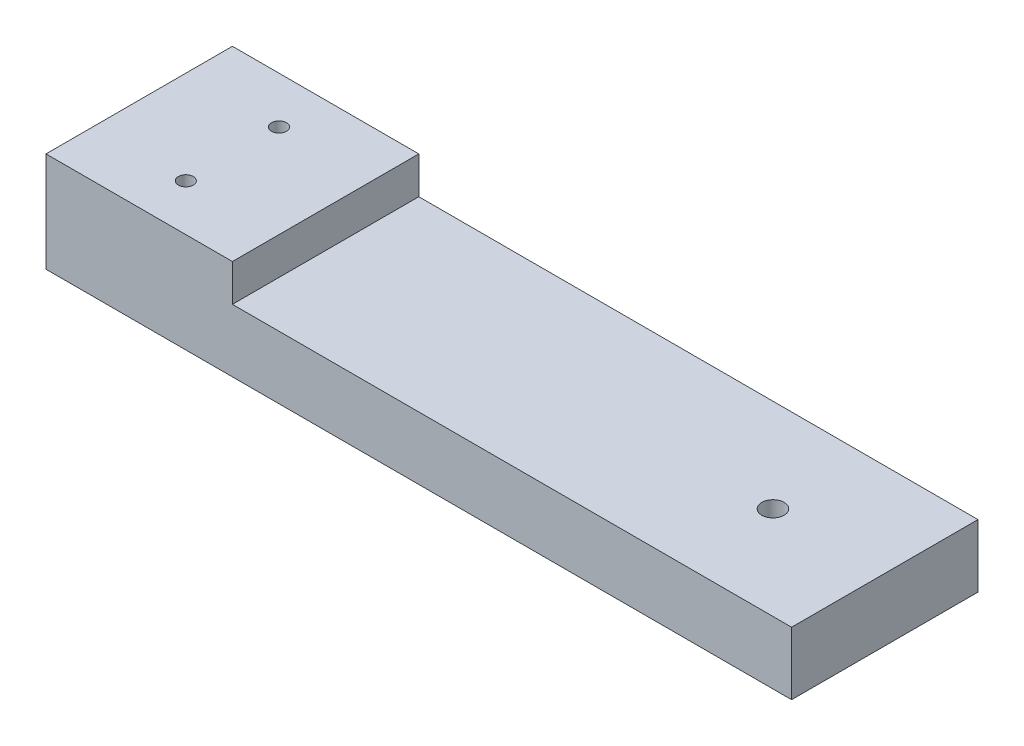
ISO-10303-21;
HEADER;
FILE_DESCRIPTION(('STEP AP214'),'2;1');
FILE_NAME('part.step','',(''),(''),'','','');
FILE_SCHEMA(('AUTOMOTIVE_DESIGN { 1 0 10303 214 1 1 1 1 }'));
ENDSEC;
DATA;
#1=APPLICATION_CONTEXT('core data for automotive mechanical design processes');
#2=APPLICATION_PROTOCOL_DEFINITION('international standard','automotive_design',2000,#1);
#3=PRODUCT_CONTEXT('',#1,'mechanical');
#4=PRODUCT('Part','Part','',(#3));
#5=PRODUCT_RELATED_PRODUCT_CATEGORY('part','',(#4));
#6=PRODUCT_DEFINITION_FORMATION('','',#4);
#7=PRODUCT_DEFINITION_CONTEXT('part definition',#1,'design');
#8=PRODUCT_DEFINITION('design','',#6,#7);
#9=PRODUCT_DEFINITION_SHAPE('','',#8);
#10=(LENGTH_UNIT() NAMED_UNIT(*) SI_UNIT(.MILLI.,.METRE.));
#11=(NAMED_UNIT(*) PLANE_ANGLE_UNIT() SI_UNIT($,.RADIAN.));
#12=(NAMED_UNIT(*) SI_UNIT($,.STERADIAN.) SOLID_ANGLE_UNIT());
#13=UNCERTAINTY_MEASURE_WITH_UNIT(LENGTH_MEASURE(1.E-05),#10,'distance_accuracy_value','');
#14=(GEOMETRIC_REPRESENTATION_CONTEXT(3) GLOBAL_UNCERTAINTY_ASSIGNED_CONTEXT((#13)) GLOBAL_UNIT_ASSIGNED_CONTEXT((#10,
#11,#12)) REPRESENTATION_CONTEXT('',''));
#15=CARTESIAN_POINT('',(0.,0.,0.));
#16=DIRECTION('',(0.,0.,1.));
#17=DIRECTION('',(1.,0.,0.));
#18=AXIS2_PLACEMENT_3D('',#15,#16,#17);
#19=CARTESIAN_POINT('',(0.,26.8,0.));
#20=DIRECTION('',(0.,0.,-1.));
#21=DIRECTION('',(-1.,0.,0.));
#22=AXIS2_PLACEMENT_3D('',#19,#20,#21);
#23=PLANE('',#22);
#24=DIRECTION('',(1.,0.,0.));
#25=VECTOR('',#24,1.);
#26=CARTESIAN_POINT('',(0.,0.,0.));
#27=LINE('',#26,#25);
#28=CARTESIAN_POINT('',(0.,0.,0.));
#29=VERTEX_POINT('',#28);
#30=CARTESIAN_POINT('',(200.,0.,0.));
#31=VERTEX_POINT('',#30);
#32=EDGE_CURVE('E108',#29,#31,#27,.T.);
#33=ORIENTED_EDGE('',*,*,#32,.T.);
#34=DIRECTION('',(0.,-1.,0.));
#35=VECTOR('',#34,1.);
#36=CARTESIAN_POINT('',(200.,16.85,0.));
#37=LINE('',#36,#35);
#38=CARTESIAN_POINT('',(200.,16.85,0.));
#39=VERTEX_POINT('',#38);
#40=EDGE_CURVE('E109',#39,#31,#37,.T.);
#41=ORIENTED_EDGE('',*,*,#40,.F.);
#42=DIRECTION('',(1.,0.,0.));
#43=VECTOR('',#42,1.);
#44=CARTESIAN_POINT('',(0.,16.85,0.));
#45=LINE('',#44,#43);
#46=CARTESIAN_POINT('',(50.,16.85,0.));
#47=VERTEX_POINT('',#46);
#48=EDGE_CURVE('E112',#47,#39,#45,.T.);
#49=ORIENTED_EDGE('',*,*,#48,.F.);
#50=DIRECTION('',(0.,-1.,0.));
#51=VECTOR('',#50,1.);
#52=CARTESIAN_POINT('',(50.,26.8,0.));
#53=LINE('',#52,#51);
#54=CARTESIAN_POINT('',(50.,26.8,0.));
#55=VERTEX_POINT('',#54);
#56=EDGE_CURVE('E11',#55,#47,#53,.T.);
#57=ORIENTED_EDGE('',*,*,#56,.F.);
#58=DIRECTION('',(1.,0.,0.));
#59=VECTOR('',#58,1.);
#60=CARTESIAN_POINT('',(0.,26.8,0.));
#61=LINE('',#60,#59);
#62=CARTESIAN_POINT('',(0.,26.8,0.));
#63=VERTEX_POINT('',#62);
#64=EDGE_CURVE('E126',#63,#55,#61,.T.);
#65=ORIENTED_EDGE('',*,*,#64,.F.);
#66=DIRECTION('',(0.,-1.,0.));
#67=VECTOR('',#66,1.);
#68=CARTESIAN_POINT('',(0.,26.8,0.));
#69=LINE('',#68,#67);
#70=EDGE_CURVE('E61',#63,#29,#69,.T.);
#71=ORIENTED_EDGE('',*,*,#70,.T.);
#72=EDGE_LOOP('',(#33,#41,#49,#57,#65,#71));
#73=FACE_BOUND('',#72,.T.);
#74=ADVANCED_FACE('F37',(#73),#23,.F.);
#75=CARTESIAN_POINT('',(50.,26.8,0.));
#76=DIRECTION('',(-1.,0.,0.));
#77=DIRECTION('',(0.,0.,1.));
#78=AXIS2_PLACEMENT_3D('',#75,#76,#77);
#79=PLANE('',#78);
#80=ORIENTED_EDGE('',*,*,#56,.T.);
#81=DIRECTION('',(0.,0.,-1.));
#82=VECTOR('',#81,1.);
#83=CARTESIAN_POINT('',(50.,16.85,0.));
#84=LINE('',#83,#82);
#85=CARTESIAN_POINT('',(50.,16.85,-50.));
#86=VERTEX_POINT('',#85);
#87=EDGE_CURVE('E118',#47,#86,#84,.T.);
#88=ORIENTED_EDGE('',*,*,#87,.T.);
#89=DIRECTION('',(0.,-1.,0.));
#90=VECTOR('',#89,1.);
#91=CARTESIAN_POINT('',(50.,26.8,-50.));
#92=LINE('',#91,#90);
#93=CARTESIAN_POINT('',(50.,26.8,-50.));
#94=VERTEX_POINT('',#93);
#95=EDGE_CURVE('E45',#94,#86,#92,.T.);
#96=ORIENTED_EDGE('',*,*,#95,.F.);
#97=DIRECTION('',(0.,0.,-1.));
#98=VECTOR('',#97,1.);
#99=CARTESIAN_POINT('',(50.,26.8,0.));
#100=LINE('',#99,#98);
#101=EDGE_CURVE('E81',#55,#94,#100,.T.);
#102=ORIENTED_EDGE('',*,*,#101,.F.);
#103=EDGE_LOOP('',(#80,#88,#96,#102));
#104=FACE_BOUND('',#103,.T.);
#105=ADVANCED_FACE('F148',(#104),#79,.F.);
#106=CARTESIAN_POINT('',(0.,26.8,-50.));
#107=DIRECTION('',(0.,0.,-1.));
#108=DIRECTION('',(-1.,0.,0.));
#109=AXIS2_PLACEMENT_3D('',#106,#107,#108);
#110=PLANE('',#109);
#111=DIRECTION('',(1.,0.,0.));
#112=VECTOR('',#111,1.);
#113=CARTESIAN_POINT('',(0.,0.,-50.));
#114=LINE('',#113,#112);
#115=CARTESIAN_POINT('',(0.,0.,-50.));
#116=VERTEX_POINT('',#115);
#117=CARTESIAN_POINT('',(200.,0.,-50.));
#118=VERTEX_POINT('',#117);
#119=EDGE_CURVE('E135',#116,#118,#114,.T.);
#120=ORIENTED_EDGE('',*,*,#119,.F.);
#121=DIRECTION('',(0.,-1.,0.));
#122=VECTOR('',#121,1.);
#123=CARTESIAN_POINT('',(0.,26.8,-50.));
#124=LINE('',#123,#122);
#125=CARTESIAN_POINT('',(0.,26.8,-50.));
#126=VERTEX_POINT('',#125);
#127=EDGE_CURVE('E140',#126,#116,#124,.T.);
#128=ORIENTED_EDGE('',*,*,#127,.F.);
#129=DIRECTION('',(1.,0.,0.));
#130=VECTOR('',#129,1.);
#131=CARTESIAN_POINT('',(0.,26.8,-50.));
#132=LINE('',#131,#130);
#133=EDGE_CURVE('E130',#126,#94,#132,.T.);
#134=ORIENTED_EDGE('',*,*,#133,.T.);
#135=ORIENTED_EDGE('',*,*,#95,.T.);
#136=DIRECTION('',(1.,0.,0.));
#137=VECTOR('',#136,1.);
#138=CARTESIAN_POINT('',(0.,16.85,-50.));
#139=LINE('',#138,#137);
#140=CARTESIAN_POINT('',(200.,16.85,-50.));
#141=VERTEX_POINT('',#140);
#142=EDGE_CURVE('E52',#86,#141,#139,.T.);
#143=ORIENTED_EDGE('',*,*,#142,.T.);
#144=DIRECTION('',(0.,-1.,0.));
#145=VECTOR('',#144,1.);
#146=CARTESIAN_POINT('',(200.,16.85,-50.));
#147=LINE('',#146,#145);
#148=EDGE_CURVE('E100',#141,#118,#147,.T.);
#149=ORIENTED_EDGE('',*,*,#148,.T.);
#150=EDGE_LOOP('',(#120,#128,#134,#135,#143,#149));
#151=FACE_BOUND('',#150,.T.);
#152=ADVANCED_FACE('F116',(#151),#110,.T.);
#153=CARTESIAN_POINT('',(0.,26.8,0.));
#154=DIRECTION('',(-1.,0.,0.));
#155=DIRECTION('',(0.,0.,1.));
#156=AXIS2_PLACEMENT_3D('',#153,#154,#155);
#157=PLANE('',#156);
#158=DIRECTION('',(0.,0.,-1.));
#159=VECTOR('',#158,1.);
#160=CARTESIAN_POINT('',(0.,0.,0.));
#161=LINE('',#160,#159);
#162=EDGE_CURVE('E128',#29,#116,#161,.T.);
#163=ORIENTED_EDGE('',*,*,#162,.F.);
#164=ORIENTED_EDGE('',*,*,#70,.F.);
#165=DIRECTION('',(0.,0.,-1.));
#166=VECTOR('',#165,1.);
#167=CARTESIAN_POINT('',(0.,26.8,0.));
#168=LINE('',#167,#166);
#169=EDGE_CURVE('E132',#63,#126,#168,.T.);
#170=ORIENTED_EDGE('',*,*,#169,.T.);
#171=ORIENTED_EDGE('',*,*,#127,.T.);
#172=EDGE_LOOP('',(#163,#164,#170,#171));
#173=FACE_BOUND('',#172,.T.);
#174=ADVANCED_FACE('F142',(#173),#157,.T.);
#175=CARTESIAN_POINT('',(0.,26.8,0.));
#176=DIRECTION('',(0.,1.,0.));
#177=DIRECTION('',(0.,0.,1.));
#178=AXIS2_PLACEMENT_3D('',#175,#176,#177);
#179=PLANE('',#178);
#180=CARTESIAN_POINT('',(25.,26.8,-12.5));
#181=DIRECTION('',(0.,-1.,0.));
#182=DIRECTION('',(0.,0.,-1.));
#183=AXIS2_PLACEMENT_3D('',#180,#181,#182);
#184=CIRCLE('',#183,2.);
#185=CARTESIAN_POINT('',(25.,26.8,-14.5));
#186=VERTEX_POINT('',#185);
#187=EDGE_CURVE('E186',#186,#186,#184,.T.);
#188=ORIENTED_EDGE('',*,*,#187,.T.);
#189=EDGE_LOOP('',(#188));
#190=FACE_BOUND('',#189,.T.);
#191=CARTESIAN_POINT('',(25.,26.8,-37.5));
#192=DIRECTION('',(0.,-1.,0.));
#193=DIRECTION('',(0.,0.,-1.));
#194=AXIS2_PLACEMENT_3D('',#191,#192,#193);
#195=CIRCLE('',#194,2.);
#196=CARTESIAN_POINT('',(25.,26.8,-39.5));
#197=VERTEX_POINT('',#196);
#198=EDGE_CURVE('E194',#197,#197,#195,.T.);
#199=ORIENTED_EDGE('',*,*,#198,.T.);
#200=EDGE_LOOP('',(#199));
#201=FACE_BOUND('',#200,.T.);
#202=ORIENTED_EDGE('',*,*,#64,.T.);
#203=ORIENTED_EDGE('',*,*,#101,.T.);
#204=ORIENTED_EDGE('',*,*,#133,.F.);
#205=ORIENTED_EDGE('',*,*,#169,.F.);
#206=EDGE_LOOP('',(#202,#203,#204,#205));
#207=FACE_BOUND('',#206,.T.);
#208=ADVANCED_FACE('F158',(#190,#201,#207),#179,.T.);
#209=CARTESIAN_POINT('',(0.,0.,0.));
#210=DIRECTION('',(0.,1.,0.));
#211=DIRECTION('',(0.,0.,1.));
#212=AXIS2_PLACEMENT_3D('',#209,#210,#211);
#213=PLANE('',#212);
#214=CARTESIAN_POINT('',(25.,0.,-12.5));
#215=DIRECTION('',(0.,-1.,0.));
#216=DIRECTION('',(0.,0.,-1.));
#217=AXIS2_PLACEMENT_3D('',#214,#215,#216);
#218=CIRCLE('',#217,2.);
#219=CARTESIAN_POINT('',(25.,0.,-14.5));
#220=VERTEX_POINT('',#219);
#221=EDGE_CURVE('E189',#220,#220,#218,.T.);
#222=ORIENTED_EDGE('',*,*,#221,.F.);
#223=EDGE_LOOP('',(#222));
#224=FACE_BOUND('',#223,.T.);
#225=CARTESIAN_POINT('',(25.,0.,-37.5));
#226=DIRECTION('',(0.,-1.,0.));
#227=DIRECTION('',(0.,0.,-1.));
#228=AXIS2_PLACEMENT_3D('',#225,#226,#227);
#229=CIRCLE('',#228,2.);
#230=CARTESIAN_POINT('',(25.,0.,-39.5));
#231=VERTEX_POINT('',#230);
#232=EDGE_CURVE('E190',#231,#231,#229,.T.);
#233=ORIENTED_EDGE('',*,*,#232,.F.);
#234=EDGE_LOOP('',(#233));
#235=FACE_BOUND('',#234,.T.);
#236=CARTESIAN_POINT('',(170.,0.,-25.));
#237=DIRECTION('',(0.,-1.,0.));
#238=DIRECTION('',(0.,0.,-1.));
#239=AXIS2_PLACEMENT_3D('',#236,#237,#238);
#240=CIRCLE('',#239,2.99999999999999);
#241=CARTESIAN_POINT('',(170.,0.,-28.));
#242=VERTEX_POINT('',#241);
#243=EDGE_CURVE('E198',#242,#242,#240,.T.);
#244=ORIENTED_EDGE('',*,*,#243,.F.);
#245=EDGE_LOOP('',(#244));
#246=FACE_BOUND('',#245,.T.);
#247=ORIENTED_EDGE('',*,*,#32,.F.);
#248=ORIENTED_EDGE('',*,*,#162,.T.);
#249=ORIENTED_EDGE('',*,*,#119,.T.);
#250=DIRECTION('',(0.,0.,1.));
#251=VECTOR('',#250,1.);
#252=CARTESIAN_POINT('',(200.,0.,0.));
#253=LINE('',#252,#251);
#254=EDGE_CURVE('E105',#118,#31,#253,.T.);
#255=ORIENTED_EDGE('',*,*,#254,.T.);
#256=EDGE_LOOP('',(#247,#248,#249,#255));
#257=FACE_BOUND('',#256,.T.);
#258=ADVANCED_FACE('F146',(#224,#235,#246,#257),#213,.F.);
#259=CARTESIAN_POINT('',(200.,16.85,0.));
#260=DIRECTION('',(1.,0.,0.));
#261=DIRECTION('',(0.,0.,-1.));
#262=AXIS2_PLACEMENT_3D('',#259,#260,#261);
#263=PLANE('',#262);
#264=ORIENTED_EDGE('',*,*,#254,.F.);
#265=ORIENTED_EDGE('',*,*,#148,.F.);
#266=DIRECTION('',(0.,0.,1.));
#267=VECTOR('',#266,1.);
#268=CARTESIAN_POINT('',(200.,16.85,0.));
#269=LINE('',#268,#267);
#270=EDGE_CURVE('E103',#141,#39,#269,.T.);
#271=ORIENTED_EDGE('',*,*,#270,.T.);
#272=ORIENTED_EDGE('',*,*,#40,.T.);
#273=EDGE_LOOP('',(#264,#265,#271,#272));
#274=FACE_BOUND('',#273,.T.);
#275=ADVANCED_FACE('F101',(#274),#263,.T.);
#276=CARTESIAN_POINT('',(0.,16.85,0.));
#277=DIRECTION('',(0.,1.,0.));
#278=DIRECTION('',(0.,0.,1.));
#279=AXIS2_PLACEMENT_3D('',#276,#277,#278);
#280=PLANE('',#279);
#281=CARTESIAN_POINT('',(170.,16.85,-25.));
#282=DIRECTION('',(0.,1.,0.));
#283=DIRECTION('',(0.,0.,1.));
#284=AXIS2_PLACEMENT_3D('',#281,#282,#283);
#285=CIRCLE('',#284,2.99999999999999);
#286=CARTESIAN_POINT('',(170.,16.85,-22.));
#287=VERTEX_POINT('',#286);
#288=EDGE_CURVE('E40',#287,#287,#285,.T.);
#289=ORIENTED_EDGE('',*,*,#288,.F.);
#290=EDGE_LOOP('',(#289));
#291=FACE_BOUND('',#290,.T.);
#292=ORIENTED_EDGE('',*,*,#270,.F.);
#293=ORIENTED_EDGE('',*,*,#142,.F.);
#294=ORIENTED_EDGE('',*,*,#87,.F.);
#295=ORIENTED_EDGE('',*,*,#48,.T.);
#296=EDGE_LOOP('',(#292,#293,#294,#295));
#297=FACE_BOUND('',#296,.T.);
#298=ADVANCED_FACE('F111',(#291,#297),#280,.T.);
#299=CARTESIAN_POINT('',(170.,26.8,-25.));
#300=DIRECTION('',(0.,-1.,0.));
#301=DIRECTION('',(0.,0.,-1.));
#302=AXIS2_PLACEMENT_3D('',#299,#300,#301);
#303=CYLINDRICAL_SURFACE('',#302,2.99999999999999);
#304=ORIENTED_EDGE('',*,*,#288,.T.);
#305=EDGE_LOOP('',(#304));
#306=FACE_BOUND('',#305,.T.);
#307=ORIENTED_EDGE('',*,*,#243,.T.);
#308=EDGE_LOOP('',(#307));
#309=FACE_BOUND('',#308,.T.);
#310=ADVANCED_FACE('F169',(#306,#309),#303,.F.);
#311=CARTESIAN_POINT('',(25.,26.8,-37.5));
#312=DIRECTION('',(0.,-1.,0.));
#313=DIRECTION('',(0.,0.,-1.));
#314=AXIS2_PLACEMENT_3D('',#311,#312,#313);
#315=CYLINDRICAL_SURFACE('',#314,2.);
#316=ORIENTED_EDGE('',*,*,#198,.F.);
#317=EDGE_LOOP('',(#316));
#318=FACE_BOUND('',#317,.T.);
#319=ORIENTED_EDGE('',*,*,#232,.T.);
#320=EDGE_LOOP('',(#319));
#321=FACE_BOUND('',#320,.T.);
#322=ADVANCED_FACE('F173',(#318,#321),#315,.F.);
#323=CARTESIAN_POINT('',(25.,26.8,-12.5));
#324=DIRECTION('',(0.,-1.,0.));
#325=DIRECTION('',(0.,0.,-1.));
#326=AXIS2_PLACEMENT_3D('',#323,#324,#325);
#327=CYLINDRICAL_SURFACE('',#326,2.);
#328=ORIENTED_EDGE('',*,*,#187,.F.);
#329=EDGE_LOOP('',(#328));
#330=FACE_BOUND('',#329,.T.);
#331=ORIENTED_EDGE('',*,*,#221,.T.);
#332=EDGE_LOOP('',(#331));
#333=FACE_BOUND('',#332,.T.);
#334=ADVANCED_FACE('F177',(#330,#333),#327,.F.);
#335=CLOSED_SHELL('',(#74,#105,#152,#174,#208,#258,#275,#298,#310,#322,#334));
#336=MANIFOLD_SOLID_BREP('B2',#335);
#337=ADVANCED_BREP_SHAPE_REPRESENTATION('',(#18,#336),#14);
#338=SHAPE_DEFINITION_REPRESENTATION(#9,#337);
ENDSEC;
END-ISO-10303-21;
